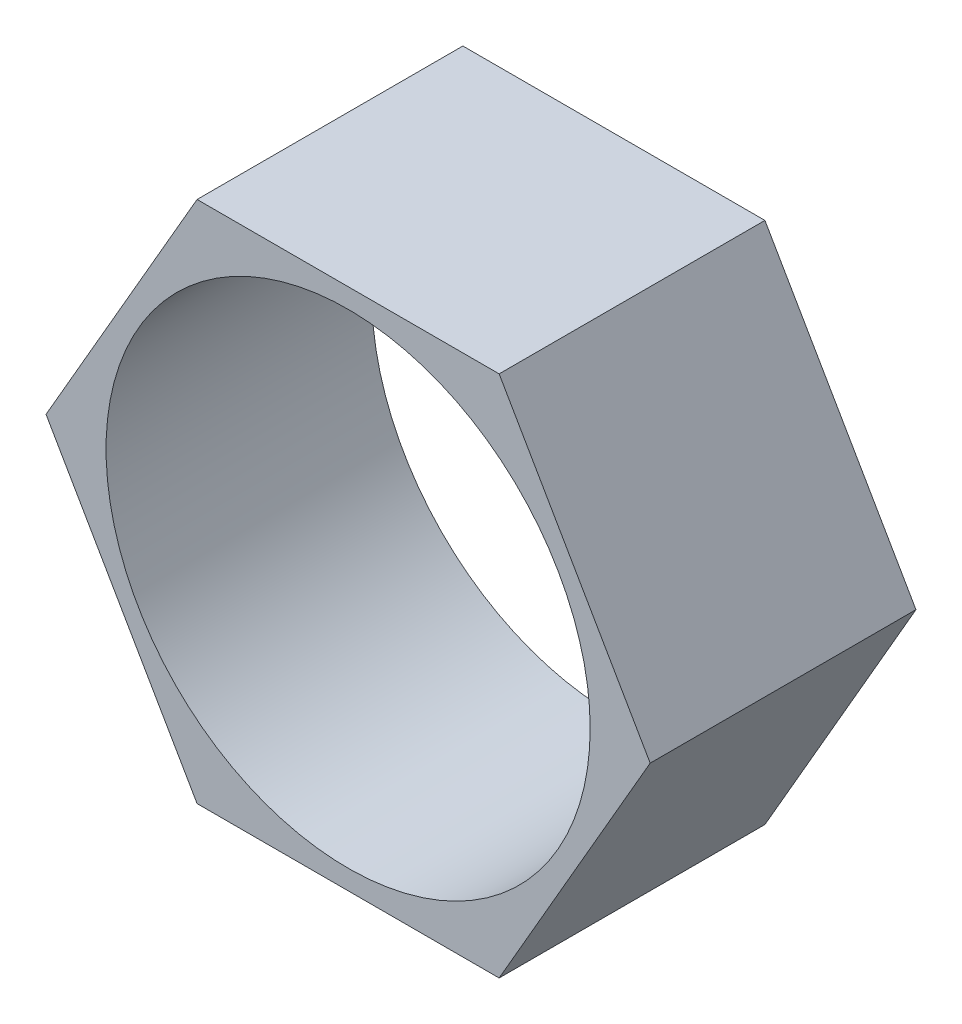
ISO-10303-21;
HEADER;
FILE_DESCRIPTION(('STEP AP214'),'2;1');
FILE_NAME('part.step','',(''),(''),'','','');
FILE_SCHEMA(('AUTOMOTIVE_DESIGN { 1 0 10303 214 1 1 1 1 }'));
ENDSEC;
DATA;
#1=APPLICATION_CONTEXT('core data for automotive mechanical design processes');
#2=APPLICATION_PROTOCOL_DEFINITION('international standard','automotive_design',2000,#1);
#3=PRODUCT_CONTEXT('',#1,'mechanical');
#4=PRODUCT('Part','Part','',(#3));
#5=PRODUCT_RELATED_PRODUCT_CATEGORY('part','',(#4));
#6=PRODUCT_DEFINITION_FORMATION('','',#4);
#7=PRODUCT_DEFINITION_CONTEXT('part definition',#1,'design');
#8=PRODUCT_DEFINITION('design','',#6,#7);
#9=PRODUCT_DEFINITION_SHAPE('','',#8);
#10=(LENGTH_UNIT() NAMED_UNIT(*) SI_UNIT(.MILLI.,.METRE.));
#11=(NAMED_UNIT(*) PLANE_ANGLE_UNIT() SI_UNIT($,.RADIAN.));
#12=(NAMED_UNIT(*) SI_UNIT($,.STERADIAN.) SOLID_ANGLE_UNIT());
#13=UNCERTAINTY_MEASURE_WITH_UNIT(LENGTH_MEASURE(1.E-05),#10,'distance_accuracy_value','');
#14=(GEOMETRIC_REPRESENTATION_CONTEXT(3) GLOBAL_UNCERTAINTY_ASSIGNED_CONTEXT((#13)) GLOBAL_UNIT_ASSIGNED_CONTEXT((#10,
#11,#12)) REPRESENTATION_CONTEXT('',''));
#15=CARTESIAN_POINT('',(0.,0.,0.));
#16=DIRECTION('',(0.,0.,1.));
#17=DIRECTION('',(1.,0.,0.));
#18=AXIS2_PLACEMENT_3D('',#15,#16,#17);
#19=CARTESIAN_POINT('',(3.81355838483151,11.583111087823,12.7));
#20=DIRECTION('',(0.,-1.,0.));
#21=DIRECTION('',(1.,0.,0.));
#22=AXIS2_PLACEMENT_3D('',#19,#20,#21);
#23=PLANE('',#22);
#24=DIRECTION('',(-1.,0.,0.));
#25=VECTOR('',#24,1.);
#26=CARTESIAN_POINT('',(3.81355838483151,11.583111087823,0.));
#27=LINE('',#26,#25);
#28=CARTESIAN_POINT('',(3.81355838483151,11.583111087823,0.));
#29=VERTEX_POINT('',#28);
#30=CARTESIAN_POINT('',(-10.6201983449091,11.583111087823,0.));
#31=VERTEX_POINT('',#30);
#32=EDGE_CURVE('E128',#29,#31,#27,.T.);
#33=ORIENTED_EDGE('',*,*,#32,.T.);
#34=DIRECTION('',(0.,0.,-1.));
#35=VECTOR('',#34,1.);
#36=CARTESIAN_POINT('',(-10.6201983449091,11.583111087823,12.7));
#37=LINE('',#36,#35);
#38=CARTESIAN_POINT('',(-10.6201983449091,11.583111087823,12.7));
#39=VERTEX_POINT('',#38);
#40=EDGE_CURVE('E11',#39,#31,#37,.T.);
#41=ORIENTED_EDGE('',*,*,#40,.F.);
#42=DIRECTION('',(-1.,0.,0.));
#43=VECTOR('',#42,1.);
#44=CARTESIAN_POINT('',(3.81355838483151,11.583111087823,12.7));
#45=LINE('',#44,#43);
#46=CARTESIAN_POINT('',(3.81355838483151,11.583111087823,12.7));
#47=VERTEX_POINT('',#46);
#48=EDGE_CURVE('E145',#47,#39,#45,.T.);
#49=ORIENTED_EDGE('',*,*,#48,.F.);
#50=DIRECTION('',(0.,0.,-1.));
#51=VECTOR('',#50,1.);
#52=CARTESIAN_POINT('',(3.81355838483151,11.583111087823,12.7));
#53=LINE('',#52,#51);
#54=EDGE_CURVE('E124',#47,#29,#53,.T.);
#55=ORIENTED_EDGE('',*,*,#54,.T.);
#56=EDGE_LOOP('',(#33,#41,#49,#55));
#57=FACE_BOUND('',#56,.T.);
#58=ADVANCED_FACE('F39',(#57),#23,.F.);
#59=CARTESIAN_POINT('',(-10.6201983449091,11.583111087823,12.7));
#60=DIRECTION('',(0.866025403784439,-0.5,0.));
#61=DIRECTION('',(0.5,0.866025403784439,0.));
#62=AXIS2_PLACEMENT_3D('',#59,#60,#61);
#63=PLANE('',#62);
#64=DIRECTION('',(-0.5,-0.866025403784439,0.));
#65=VECTOR('',#64,1.);
#66=CARTESIAN_POINT('',(-10.6201983449091,11.583111087823,0.));
#67=LINE('',#66,#65);
#68=CARTESIAN_POINT('',(-17.8370767097795,-0.916888912177013,0.));
#69=VERTEX_POINT('',#68);
#70=EDGE_CURVE('E132',#31,#69,#67,.T.);
#71=ORIENTED_EDGE('',*,*,#70,.T.);
#72=DIRECTION('',(0.,0.,-1.));
#73=VECTOR('',#72,1.);
#74=CARTESIAN_POINT('',(-17.8370767097795,-0.916888912177013,12.7));
#75=LINE('',#74,#73);
#76=CARTESIAN_POINT('',(-17.8370767097795,-0.916888912177013,12.7));
#77=VERTEX_POINT('',#76);
#78=EDGE_CURVE('E48',#77,#69,#75,.T.);
#79=ORIENTED_EDGE('',*,*,#78,.F.);
#80=DIRECTION('',(-0.5,-0.866025403784439,0.));
#81=VECTOR('',#80,1.);
#82=CARTESIAN_POINT('',(-10.6201983449091,11.583111087823,12.7));
#83=LINE('',#82,#81);
#84=EDGE_CURVE('E93',#39,#77,#83,.T.);
#85=ORIENTED_EDGE('',*,*,#84,.F.);
#86=ORIENTED_EDGE('',*,*,#40,.T.);
#87=EDGE_LOOP('',(#71,#79,#85,#86));
#88=FACE_BOUND('',#87,.T.);
#89=ADVANCED_FACE('F174',(#88),#63,.F.);
#90=CARTESIAN_POINT('',(-17.8370767097795,-0.916888912177013,12.7));
#91=DIRECTION('',(0.866025403784439,0.5,0.));
#92=DIRECTION('',(-0.5,0.866025403784439,0.));
#93=AXIS2_PLACEMENT_3D('',#90,#91,#92);
#94=PLANE('',#93);
#95=DIRECTION('',(0.5,-0.866025403784439,0.));
#96=VECTOR('',#95,1.);
#97=CARTESIAN_POINT('',(-17.8370767097795,-0.916888912177013,0.));
#98=LINE('',#97,#96);
#99=CARTESIAN_POINT('',(-10.6201983449091,-13.416888912177,0.));
#100=VERTEX_POINT('',#99);
#101=EDGE_CURVE('E136',#69,#100,#98,.T.);
#102=ORIENTED_EDGE('',*,*,#101,.T.);
#103=DIRECTION('',(0.,0.,-1.));
#104=VECTOR('',#103,1.);
#105=CARTESIAN_POINT('',(-10.6201983449091,-13.416888912177,12.7));
#106=LINE('',#105,#104);
#107=CARTESIAN_POINT('',(-10.6201983449091,-13.416888912177,12.7));
#108=VERTEX_POINT('',#107);
#109=EDGE_CURVE('E117',#108,#100,#106,.T.);
#110=ORIENTED_EDGE('',*,*,#109,.F.);
#111=DIRECTION('',(0.5,-0.866025403784439,0.));
#112=VECTOR('',#111,1.);
#113=CARTESIAN_POINT('',(-17.8370767097795,-0.916888912177013,12.7));
#114=LINE('',#113,#112);
#115=EDGE_CURVE('E106',#77,#108,#114,.T.);
#116=ORIENTED_EDGE('',*,*,#115,.F.);
#117=ORIENTED_EDGE('',*,*,#78,.T.);
#118=EDGE_LOOP('',(#102,#110,#116,#117));
#119=FACE_BOUND('',#118,.T.);
#120=ADVANCED_FACE('F155',(#119),#94,.F.);
#121=CARTESIAN_POINT('',(-10.6201983449091,-13.416888912177,12.7));
#122=DIRECTION('',(0.,1.,0.));
#123=DIRECTION('',(-1.,0.,0.));
#124=AXIS2_PLACEMENT_3D('',#121,#122,#123);
#125=PLANE('',#124);
#126=DIRECTION('',(1.,0.,0.));
#127=VECTOR('',#126,1.);
#128=CARTESIAN_POINT('',(-10.6201983449091,-13.416888912177,0.));
#129=LINE('',#128,#127);
#130=CARTESIAN_POINT('',(3.81355838483151,-13.416888912177,0.));
#131=VERTEX_POINT('',#130);
#132=EDGE_CURVE('E115',#100,#131,#129,.T.);
#133=ORIENTED_EDGE('',*,*,#132,.T.);
#134=DIRECTION('',(0.,0.,-1.));
#135=VECTOR('',#134,1.);
#136=CARTESIAN_POINT('',(3.81355838483151,-13.416888912177,12.7));
#137=LINE('',#136,#135);
#138=CARTESIAN_POINT('',(3.81355838483151,-13.416888912177,12.7));
#139=VERTEX_POINT('',#138);
#140=EDGE_CURVE('E112',#139,#131,#137,.T.);
#141=ORIENTED_EDGE('',*,*,#140,.F.);
#142=DIRECTION('',(1.,0.,0.));
#143=VECTOR('',#142,1.);
#144=CARTESIAN_POINT('',(-10.6201983449091,-13.416888912177,12.7));
#145=LINE('',#144,#143);
#146=EDGE_CURVE('E100',#108,#139,#145,.T.);
#147=ORIENTED_EDGE('',*,*,#146,.F.);
#148=ORIENTED_EDGE('',*,*,#109,.T.);
#149=EDGE_LOOP('',(#133,#141,#147,#148));
#150=FACE_BOUND('',#149,.T.);
#151=ADVANCED_FACE('F113',(#150),#125,.F.);
#152=CARTESIAN_POINT('',(3.81355838483151,-13.416888912177,12.7));
#153=DIRECTION('',(-0.866025403784438,0.5,0.));
#154=DIRECTION('',(-0.5,-0.866025403784439,0.));
#155=AXIS2_PLACEMENT_3D('',#152,#153,#154);
#156=PLANE('',#155);
#157=DIRECTION('',(0.5,0.866025403784438,0.));
#158=VECTOR('',#157,1.);
#159=CARTESIAN_POINT('',(3.81355838483151,-13.416888912177,0.));
#160=LINE('',#159,#158);
#161=CARTESIAN_POINT('',(11.0304367497018,-0.916888912177013,0.));
#162=VERTEX_POINT('',#161);
#163=EDGE_CURVE('E79',#131,#162,#160,.T.);
#164=ORIENTED_EDGE('',*,*,#163,.T.);
#165=DIRECTION('',(0.,0.,-1.));
#166=VECTOR('',#165,1.);
#167=CARTESIAN_POINT('',(11.0304367497018,-0.916888912177013,12.7));
#168=LINE('',#167,#166);
#169=CARTESIAN_POINT('',(11.0304367497018,-0.916888912177013,12.7));
#170=VERTEX_POINT('',#169);
#171=EDGE_CURVE('E118',#170,#162,#168,.T.);
#172=ORIENTED_EDGE('',*,*,#171,.F.);
#173=DIRECTION('',(0.5,0.866025403784438,0.));
#174=VECTOR('',#173,1.);
#175=CARTESIAN_POINT('',(3.81355838483151,-13.416888912177,12.7));
#176=LINE('',#175,#174);
#177=EDGE_CURVE('E104',#139,#170,#176,.T.);
#178=ORIENTED_EDGE('',*,*,#177,.F.);
#179=ORIENTED_EDGE('',*,*,#140,.T.);
#180=EDGE_LOOP('',(#164,#172,#178,#179));
#181=FACE_BOUND('',#180,.T.);
#182=ADVANCED_FACE('F120',(#181),#156,.F.);
#183=CARTESIAN_POINT('',(11.0304367497018,-0.916888912177013,12.7));
#184=DIRECTION('',(-0.866025403784439,-0.5,0.));
#185=DIRECTION('',(0.5,-0.866025403784439,0.));
#186=AXIS2_PLACEMENT_3D('',#183,#184,#185);
#187=PLANE('',#186);
#188=DIRECTION('',(-0.5,0.866025403784439,0.));
#189=VECTOR('',#188,1.);
#190=CARTESIAN_POINT('',(11.0304367497018,-0.916888912177013,0.));
#191=LINE('',#190,#189);
#192=EDGE_CURVE('E85',#162,#29,#191,.T.);
#193=ORIENTED_EDGE('',*,*,#192,.T.);
#194=ORIENTED_EDGE('',*,*,#54,.F.);
#195=DIRECTION('',(-0.5,0.866025403784439,0.));
#196=VECTOR('',#195,1.);
#197=CARTESIAN_POINT('',(11.0304367497018,-0.916888912177013,12.7));
#198=LINE('',#197,#196);
#199=EDGE_CURVE('E56',#170,#47,#198,.T.);
#200=ORIENTED_EDGE('',*,*,#199,.F.);
#201=ORIENTED_EDGE('',*,*,#171,.T.);
#202=EDGE_LOOP('',(#193,#194,#200,#201));
#203=FACE_BOUND('',#202,.T.);
#204=ADVANCED_FACE('F162',(#203),#187,.F.);
#205=CARTESIAN_POINT('',(0.,0.,12.7));
#206=DIRECTION('',(0.,0.,1.));
#207=DIRECTION('',(1.,0.,0.));
#208=AXIS2_PLACEMENT_3D('',#205,#206,#207);
#209=PLANE('',#208);
#210=CARTESIAN_POINT('',(-3.40331998003882,-0.91688891217705,12.7));
#211=DIRECTION('',(0.,0.,1.));
#212=DIRECTION('',(1.,0.,0.));
#213=AXIS2_PLACEMENT_3D('',#210,#211,#212);
#214=CIRCLE('',#213,11.5665);
#215=CARTESIAN_POINT('',(8.16318001996117,-0.91688891217705,12.7));
#216=VERTEX_POINT('',#215);
#217=EDGE_CURVE('E229',#216,#216,#214,.T.);
#218=ORIENTED_EDGE('',*,*,#217,.F.);
#219=EDGE_LOOP('',(#218));
#220=FACE_BOUND('',#219,.T.);
#221=ORIENTED_EDGE('',*,*,#48,.T.);
#222=ORIENTED_EDGE('',*,*,#84,.T.);
#223=ORIENTED_EDGE('',*,*,#115,.T.);
#224=ORIENTED_EDGE('',*,*,#146,.T.);
#225=ORIENTED_EDGE('',*,*,#177,.T.);
#226=ORIENTED_EDGE('',*,*,#199,.T.);
#227=EDGE_LOOP('',(#221,#222,#223,#224,#225,#226));
#228=FACE_BOUND('',#227,.T.);
#229=ADVANCED_FACE('F102',(#220,#228),#209,.T.);
#230=CARTESIAN_POINT('',(0.,0.,0.));
#231=DIRECTION('',(0.,0.,1.));
#232=DIRECTION('',(1.,0.,0.));
#233=AXIS2_PLACEMENT_3D('',#230,#231,#232);
#234=PLANE('',#233);
#235=CARTESIAN_POINT('',(-3.40331998003882,-0.91688891217705,0.));
#236=DIRECTION('',(0.,0.,1.));
#237=DIRECTION('',(1.,0.,0.));
#238=AXIS2_PLACEMENT_3D('',#235,#236,#237);
#239=CIRCLE('',#238,11.5665);
#240=CARTESIAN_POINT('',(8.16318001996117,-0.91688891217705,0.));
#241=VERTEX_POINT('',#240);
#242=EDGE_CURVE('E133',#241,#241,#239,.T.);
#243=ORIENTED_EDGE('',*,*,#242,.T.);
#244=EDGE_LOOP('',(#243));
#245=FACE_BOUND('',#244,.T.);
#246=ORIENTED_EDGE('',*,*,#32,.F.);
#247=ORIENTED_EDGE('',*,*,#192,.F.);
#248=ORIENTED_EDGE('',*,*,#163,.F.);
#249=ORIENTED_EDGE('',*,*,#132,.F.);
#250=ORIENTED_EDGE('',*,*,#101,.F.);
#251=ORIENTED_EDGE('',*,*,#70,.F.);
#252=EDGE_LOOP('',(#246,#247,#248,#249,#250,#251));
#253=FACE_BOUND('',#252,.T.);
#254=ADVANCED_FACE('F158',(#245,#253),#234,.F.);
#255=CARTESIAN_POINT('',(-3.40331998003882,-0.91688891217705,0.));
#256=DIRECTION('',(0.,0.,1.));
#257=DIRECTION('',(1.,0.,0.));
#258=AXIS2_PLACEMENT_3D('',#255,#256,#257);
#259=CYLINDRICAL_SURFACE('',#258,11.5665);
#260=ORIENTED_EDGE('',*,*,#242,.F.);
#261=EDGE_LOOP('',(#260));
#262=FACE_BOUND('',#261,.T.);
#263=ORIENTED_EDGE('',*,*,#217,.T.);
#264=EDGE_LOOP('',(#263));
#265=FACE_BOUND('',#264,.T.);
#266=ADVANCED_FACE('F211',(#262,#265),#259,.F.);
#267=CLOSED_SHELL('',(#58,#89,#120,#151,#182,#204,#229,#254,#266));
#268=MANIFOLD_SOLID_BREP('B2',#267);
#269=ADVANCED_BREP_SHAPE_REPRESENTATION('',(#18,#268),#14);
#270=SHAPE_DEFINITION_REPRESENTATION(#9,#269);
ENDSEC;
END-ISO-10303-21;
